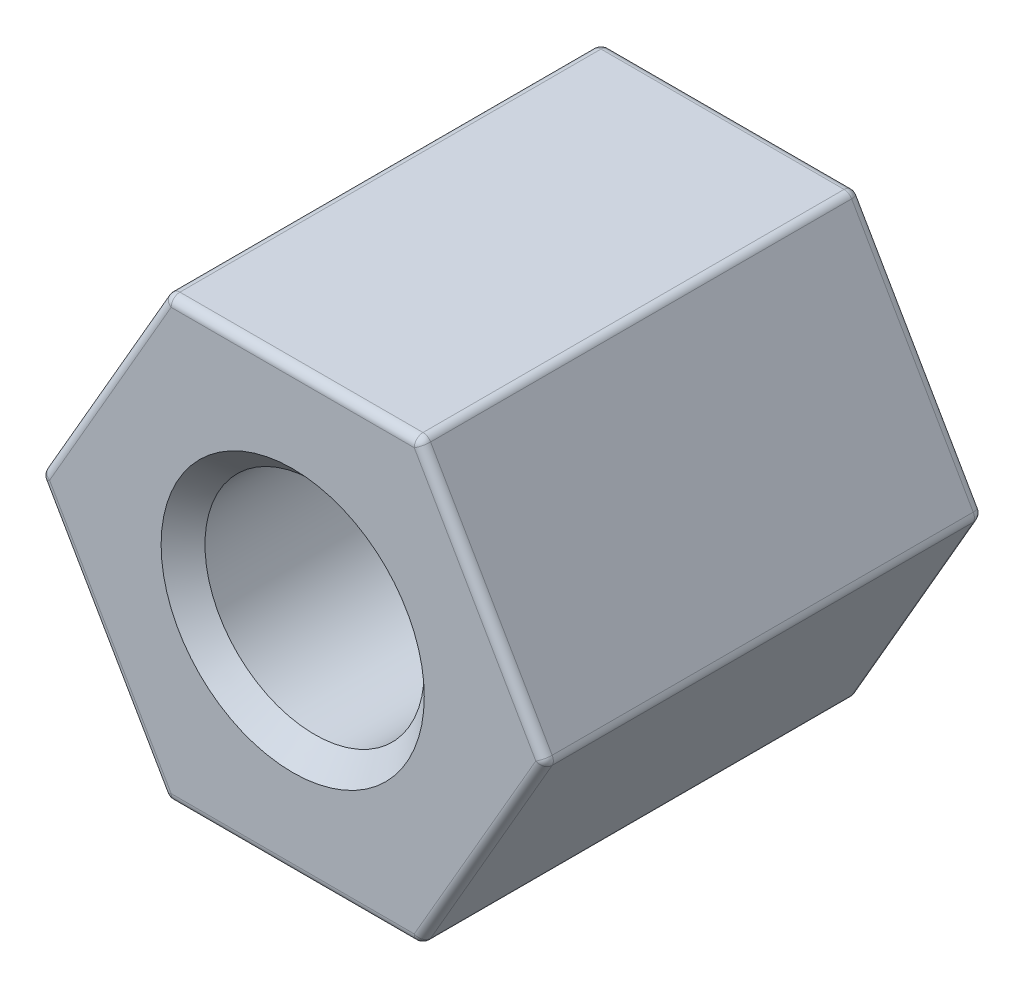
ISO-10303-21;
HEADER;
FILE_DESCRIPTION(('STEP AP214'),'2;1');
FILE_NAME('part.step','',(''),(''),'','','');
FILE_SCHEMA(('AUTOMOTIVE_DESIGN { 1 0 10303 214 1 1 1 1 }'));
ENDSEC;
DATA;
#1=APPLICATION_CONTEXT('core data for automotive mechanical design processes');
#2=APPLICATION_PROTOCOL_DEFINITION('international standard','automotive_design',2000,#1);
#3=PRODUCT_CONTEXT('',#1,'mechanical');
#4=PRODUCT('Part','Part','',(#3));
#5=PRODUCT_RELATED_PRODUCT_CATEGORY('part','',(#4));
#6=PRODUCT_DEFINITION_FORMATION('','',#4);
#7=PRODUCT_DEFINITION_CONTEXT('part definition',#1,'design');
#8=PRODUCT_DEFINITION('design','',#6,#7);
#9=PRODUCT_DEFINITION_SHAPE('','',#8);
#10=(LENGTH_UNIT() NAMED_UNIT(*) SI_UNIT(.MILLI.,.METRE.));
#11=(NAMED_UNIT(*) PLANE_ANGLE_UNIT() SI_UNIT($,.RADIAN.));
#12=(NAMED_UNIT(*) SI_UNIT($,.STERADIAN.) SOLID_ANGLE_UNIT());
#13=UNCERTAINTY_MEASURE_WITH_UNIT(LENGTH_MEASURE(1.E-05),#10,'distance_accuracy_value','');
#14=(GEOMETRIC_REPRESENTATION_CONTEXT(3) GLOBAL_UNCERTAINTY_ASSIGNED_CONTEXT((#13)) GLOBAL_UNIT_ASSIGNED_CONTEXT((#10,
#11,#12)) REPRESENTATION_CONTEXT('',''));
#15=CARTESIAN_POINT('',(0.,0.,0.));
#16=DIRECTION('',(0.,0.,1.));
#17=DIRECTION('',(1.,0.,0.));
#18=AXIS2_PLACEMENT_3D('',#15,#16,#17);
#19=CARTESIAN_POINT('',(1.44337567297407,-2.5,5.));
#20=DIRECTION('',(-0.866025403784439,0.5,0.));
#21=DIRECTION('',(-0.5,-0.866025403784439,0.));
#22=AXIS2_PLACEMENT_3D('',#19,#20,#21);
#23=PLANE('',#22);
#24=DIRECTION('',(0.5,0.866025403784439,0.));
#25=VECTOR('',#24,1.);
#26=CARTESIAN_POINT('',(1.44337567297407,-2.5,4.9));
#27=LINE('',#26,#25);
#28=CARTESIAN_POINT('',(2.85788383248865,-0.0499999999999991,4.9));
#29=VERTEX_POINT('',#28);
#30=CARTESIAN_POINT('',(1.47224318643355,-2.45,4.9));
#31=VERTEX_POINT('',#30);
#32=EDGE_CURVE('E256',#29,#31,#27,.F.);
#33=ORIENTED_EDGE('',*,*,#32,.T.);
#34=DIRECTION('',(0.,0.,-1.));
#35=VECTOR('',#34,1.);
#36=CARTESIAN_POINT('',(1.47224318643355,-2.45,5.));
#37=LINE('',#36,#35);
#38=CARTESIAN_POINT('',(1.47224318643355,-2.45,0.1));
#39=VERTEX_POINT('',#38);
#40=EDGE_CURVE('E258',#31,#39,#37,.T.);
#41=ORIENTED_EDGE('',*,*,#40,.T.);
#42=DIRECTION('',(0.5,0.866025403784439,0.));
#43=VECTOR('',#42,1.);
#44=CARTESIAN_POINT('',(1.44337567297407,-2.5,0.1));
#45=LINE('',#44,#43);
#46=CARTESIAN_POINT('',(2.85788383248865,-0.0499999999999991,0.1));
#47=VERTEX_POINT('',#46);
#48=EDGE_CURVE('E254',#39,#47,#45,.T.);
#49=ORIENTED_EDGE('',*,*,#48,.T.);
#50=DIRECTION('',(0.,0.,-1.));
#51=VECTOR('',#50,1.);
#52=CARTESIAN_POINT('',(2.85788383248865,-0.0499999999999984,5.));
#53=LINE('',#52,#51);
#54=EDGE_CURVE('E252',#47,#29,#53,.F.);
#55=ORIENTED_EDGE('',*,*,#54,.T.);
#56=EDGE_LOOP('',(#33,#41,#49,#55));
#57=FACE_BOUND('',#56,.T.);
#58=ADVANCED_FACE('F38',(#57),#23,.F.);
#59=CARTESIAN_POINT('',(2.88675134594813,0.,5.));
#60=DIRECTION('',(-0.866025403784439,-0.5,0.));
#61=DIRECTION('',(0.5,-0.866025403784439,0.));
#62=AXIS2_PLACEMENT_3D('',#59,#60,#61);
#63=PLANE('',#62);
#64=DIRECTION('',(-0.5,0.866025403784439,0.));
#65=VECTOR('',#64,1.);
#66=CARTESIAN_POINT('',(2.88675134594813,0.,4.9));
#67=LINE('',#66,#65);
#68=CARTESIAN_POINT('',(1.47224318643355,2.45,4.9));
#69=VERTEX_POINT('',#68);
#70=CARTESIAN_POINT('',(2.85788383248865,0.0500000000000006,4.9));
#71=VERTEX_POINT('',#70);
#72=EDGE_CURVE('E180',#69,#71,#67,.F.);
#73=ORIENTED_EDGE('',*,*,#72,.T.);
#74=DIRECTION('',(0.,0.,-1.));
#75=VECTOR('',#74,1.);
#76=CARTESIAN_POINT('',(2.85788383248865,0.0500000000000006,5.));
#77=LINE('',#76,#75);
#78=CARTESIAN_POINT('',(2.85788383248865,0.0500000000000006,0.1));
#79=VERTEX_POINT('',#78);
#80=EDGE_CURVE('E266',#71,#79,#77,.T.);
#81=ORIENTED_EDGE('',*,*,#80,.T.);
#82=DIRECTION('',(-0.5,0.866025403784439,0.));
#83=VECTOR('',#82,1.);
#84=CARTESIAN_POINT('',(2.88675134594813,0.,0.1));
#85=LINE('',#84,#83);
#86=CARTESIAN_POINT('',(1.47224318643355,2.45,0.1));
#87=VERTEX_POINT('',#86);
#88=EDGE_CURVE('E263',#79,#87,#85,.T.);
#89=ORIENTED_EDGE('',*,*,#88,.T.);
#90=DIRECTION('',(0.,0.,-1.));
#91=VECTOR('',#90,1.);
#92=CARTESIAN_POINT('',(1.47224318643355,2.45,5.));
#93=LINE('',#92,#91);
#94=EDGE_CURVE('E261',#87,#69,#93,.F.);
#95=ORIENTED_EDGE('',*,*,#94,.T.);
#96=EDGE_LOOP('',(#73,#81,#89,#95));
#97=FACE_BOUND('',#96,.T.);
#98=ADVANCED_FACE('F396',(#97),#63,.F.);
#99=CARTESIAN_POINT('',(1.44337567297406,2.5,5.));
#100=DIRECTION('',(0.,-1.,0.));
#101=DIRECTION('',(0.,0.,-1.));
#102=AXIS2_PLACEMENT_3D('',#99,#100,#101);
#103=PLANE('',#102);
#104=DIRECTION('',(-1.,0.,0.));
#105=VECTOR('',#104,1.);
#106=CARTESIAN_POINT('',(1.44337567297406,2.5,4.9));
#107=LINE('',#106,#105);
#108=CARTESIAN_POINT('',(-1.3856406460551,2.5,4.9));
#109=VERTEX_POINT('',#108);
#110=CARTESIAN_POINT('',(1.3856406460551,2.5,4.9));
#111=VERTEX_POINT('',#110);
#112=EDGE_CURVE('E47',#109,#111,#107,.F.);
#113=ORIENTED_EDGE('',*,*,#112,.T.);
#114=DIRECTION('',(0.,0.,-1.));
#115=VECTOR('',#114,1.);
#116=CARTESIAN_POINT('',(1.3856406460551,2.5,5.));
#117=LINE('',#116,#115);
#118=CARTESIAN_POINT('',(1.3856406460551,2.5,0.1));
#119=VERTEX_POINT('',#118);
#120=EDGE_CURVE('E11',#111,#119,#117,.T.);
#121=ORIENTED_EDGE('',*,*,#120,.T.);
#122=DIRECTION('',(-1.,0.,0.));
#123=VECTOR('',#122,1.);
#124=CARTESIAN_POINT('',(1.44337567297406,2.5,0.1));
#125=LINE('',#124,#123);
#126=CARTESIAN_POINT('',(-1.3856406460551,2.5,0.1));
#127=VERTEX_POINT('',#126);
#128=EDGE_CURVE('E269',#119,#127,#125,.T.);
#129=ORIENTED_EDGE('',*,*,#128,.T.);
#130=DIRECTION('',(0.,0.,-1.));
#131=VECTOR('',#130,1.);
#132=CARTESIAN_POINT('',(-1.3856406460551,2.5,5.));
#133=LINE('',#132,#131);
#134=EDGE_CURVE('E58',#127,#109,#133,.F.);
#135=ORIENTED_EDGE('',*,*,#134,.T.);
#136=EDGE_LOOP('',(#113,#121,#129,#135));
#137=FACE_BOUND('',#136,.T.);
#138=ADVANCED_FACE('F402',(#137),#103,.F.);
#139=CARTESIAN_POINT('',(-1.44337567297406,2.5,5.));
#140=DIRECTION('',(0.866025403784439,-0.5,0.));
#141=DIRECTION('',(0.5,0.866025403784439,0.));
#142=AXIS2_PLACEMENT_3D('',#139,#140,#141);
#143=PLANE('',#142);
#144=DIRECTION('',(-0.5,-0.866025403784439,0.));
#145=VECTOR('',#144,1.);
#146=CARTESIAN_POINT('',(-1.44337567297406,2.5,0.1));
#147=LINE('',#146,#145);
#148=CARTESIAN_POINT('',(-1.47224318643355,2.45,0.1));
#149=VERTEX_POINT('',#148);
#150=CARTESIAN_POINT('',(-2.85788383248865,0.05,0.1));
#151=VERTEX_POINT('',#150);
#152=EDGE_CURVE('E214',#149,#151,#147,.T.);
#153=ORIENTED_EDGE('',*,*,#152,.T.);
#154=DIRECTION('',(0.,0.,-1.));
#155=VECTOR('',#154,1.);
#156=CARTESIAN_POINT('',(-2.85788383248865,0.0500000000000001,5.));
#157=LINE('',#156,#155);
#158=CARTESIAN_POINT('',(-2.85788383248865,0.05,4.9));
#159=VERTEX_POINT('',#158);
#160=EDGE_CURVE('E219',#151,#159,#157,.F.);
#161=ORIENTED_EDGE('',*,*,#160,.T.);
#162=DIRECTION('',(-0.5,-0.866025403784439,0.));
#163=VECTOR('',#162,1.);
#164=CARTESIAN_POINT('',(-1.44337567297406,2.5,4.9));
#165=LINE('',#164,#163);
#166=CARTESIAN_POINT('',(-1.47224318643355,2.45,4.9));
#167=VERTEX_POINT('',#166);
#168=EDGE_CURVE('E216',#159,#167,#165,.F.);
#169=ORIENTED_EDGE('',*,*,#168,.T.);
#170=DIRECTION('',(0.,0.,-1.));
#171=VECTOR('',#170,1.);
#172=CARTESIAN_POINT('',(-1.47224318643355,2.45,5.));
#173=LINE('',#172,#171);
#174=EDGE_CURVE('E212',#167,#149,#173,.T.);
#175=ORIENTED_EDGE('',*,*,#174,.T.);
#176=EDGE_LOOP('',(#153,#161,#169,#175));
#177=FACE_BOUND('',#176,.T.);
#178=ADVANCED_FACE('F547',(#177),#143,.F.);
#179=CARTESIAN_POINT('',(-2.88675134594813,0.,5.));
#180=DIRECTION('',(0.866025403784439,0.5,0.));
#181=DIRECTION('',(-0.5,0.866025403784439,0.));
#182=AXIS2_PLACEMENT_3D('',#179,#180,#181);
#183=PLANE('',#182);
#184=DIRECTION('',(0.5,-0.866025403784439,0.));
#185=VECTOR('',#184,1.);
#186=CARTESIAN_POINT('',(-2.88675134594813,0.,4.9));
#187=LINE('',#186,#185);
#188=CARTESIAN_POINT('',(-1.47224318643355,-2.45,4.9));
#189=VERTEX_POINT('',#188);
#190=CARTESIAN_POINT('',(-2.85788383248865,-0.0500000000000004,4.9));
#191=VERTEX_POINT('',#190);
#192=EDGE_CURVE('E238',#189,#191,#187,.F.);
#193=ORIENTED_EDGE('',*,*,#192,.T.);
#194=DIRECTION('',(0.,0.,-1.));
#195=VECTOR('',#194,1.);
#196=CARTESIAN_POINT('',(-2.85788383248865,-0.0500000000000004,5.));
#197=LINE('',#196,#195);
#198=CARTESIAN_POINT('',(-2.85788383248865,-0.0500000000000004,0.1));
#199=VERTEX_POINT('',#198);
#200=EDGE_CURVE('E240',#191,#199,#197,.T.);
#201=ORIENTED_EDGE('',*,*,#200,.T.);
#202=DIRECTION('',(0.5,-0.866025403784439,0.));
#203=VECTOR('',#202,1.);
#204=CARTESIAN_POINT('',(-2.88675134594813,0.,0.1));
#205=LINE('',#204,#203);
#206=CARTESIAN_POINT('',(-1.47224318643355,-2.45,0.1));
#207=VERTEX_POINT('',#206);
#208=EDGE_CURVE('E236',#199,#207,#205,.T.);
#209=ORIENTED_EDGE('',*,*,#208,.T.);
#210=DIRECTION('',(0.,0.,-1.));
#211=VECTOR('',#210,1.);
#212=CARTESIAN_POINT('',(-1.47224318643355,-2.45,5.));
#213=LINE('',#212,#211);
#214=EDGE_CURVE('E234',#207,#189,#213,.F.);
#215=ORIENTED_EDGE('',*,*,#214,.T.);
#216=EDGE_LOOP('',(#193,#201,#209,#215));
#217=FACE_BOUND('',#216,.T.);
#218=ADVANCED_FACE('F551',(#217),#183,.F.);
#219=CARTESIAN_POINT('',(-1.44337567297406,-2.5,5.));
#220=DIRECTION('',(0.,1.,0.));
#221=DIRECTION('',(0.,0.,1.));
#222=AXIS2_PLACEMENT_3D('',#219,#220,#221);
#223=PLANE('',#222);
#224=DIRECTION('',(1.,0.,0.));
#225=VECTOR('',#224,1.);
#226=CARTESIAN_POINT('',(-1.44337567297406,-2.5,4.9));
#227=LINE('',#226,#225);
#228=CARTESIAN_POINT('',(1.3856406460551,-2.5,4.9));
#229=VERTEX_POINT('',#228);
#230=CARTESIAN_POINT('',(-1.3856406460551,-2.5,4.9));
#231=VERTEX_POINT('',#230);
#232=EDGE_CURVE('E247',#229,#231,#227,.F.);
#233=ORIENTED_EDGE('',*,*,#232,.T.);
#234=DIRECTION('',(0.,0.,-1.));
#235=VECTOR('',#234,1.);
#236=CARTESIAN_POINT('',(-1.3856406460551,-2.5,5.));
#237=LINE('',#236,#235);
#238=CARTESIAN_POINT('',(-1.3856406460551,-2.5,0.1));
#239=VERTEX_POINT('',#238);
#240=EDGE_CURVE('E249',#231,#239,#237,.T.);
#241=ORIENTED_EDGE('',*,*,#240,.T.);
#242=DIRECTION('',(1.,0.,0.));
#243=VECTOR('',#242,1.);
#244=CARTESIAN_POINT('',(-1.44337567297406,-2.5,0.1));
#245=LINE('',#244,#243);
#246=CARTESIAN_POINT('',(1.3856406460551,-2.5,0.1));
#247=VERTEX_POINT('',#246);
#248=EDGE_CURVE('E245',#239,#247,#245,.T.);
#249=ORIENTED_EDGE('',*,*,#248,.T.);
#250=DIRECTION('',(0.,0.,-1.));
#251=VECTOR('',#250,1.);
#252=CARTESIAN_POINT('',(1.3856406460551,-2.5,5.));
#253=LINE('',#252,#251);
#254=EDGE_CURVE('E243',#247,#229,#253,.F.);
#255=ORIENTED_EDGE('',*,*,#254,.T.);
#256=EDGE_LOOP('',(#233,#241,#249,#255));
#257=FACE_BOUND('',#256,.T.);
#258=ADVANCED_FACE('F557',(#257),#223,.F.);
#259=CARTESIAN_POINT('',(2.88675134594813,0.,5.));
#260=DIRECTION('',(0.,0.,1.));
#261=DIRECTION('',(1.,0.,0.));
#262=AXIS2_PLACEMENT_3D('',#259,#260,#261);
#263=PLANE('',#262);
#264=DIRECTION('',(-1.,0.,0.));
#265=VECTOR('',#264,1.);
#266=CARTESIAN_POINT('',(-1.44337567297406,2.4,5.));
#267=LINE('',#266,#265);
#268=CARTESIAN_POINT('',(1.3856406460551,2.4,5.));
#269=VERTEX_POINT('',#268);
#270=CARTESIAN_POINT('',(-1.3856406460551,2.4,5.));
#271=VERTEX_POINT('',#270);
#272=EDGE_CURVE('E167',#269,#271,#267,.T.);
#273=ORIENTED_EDGE('',*,*,#272,.T.);
#274=DIRECTION('',(-0.5,-0.866025403784439,0.));
#275=VECTOR('',#274,1.);
#276=CARTESIAN_POINT('',(-2.80014880556968,-0.0500000000000006,5.));
#277=LINE('',#276,#275);
#278=CARTESIAN_POINT('',(-2.7712812921102,0.,5.));
#279=VERTEX_POINT('',#278);
#280=EDGE_CURVE('E210',#271,#279,#277,.T.);
#281=ORIENTED_EDGE('',*,*,#280,.T.);
#282=DIRECTION('',(0.5,-0.866025403784439,0.));
#283=VECTOR('',#282,1.);
#284=CARTESIAN_POINT('',(-1.35677313259562,-2.45,5.));
#285=LINE('',#284,#283);
#286=CARTESIAN_POINT('',(-1.3856406460551,-2.4,5.));
#287=VERTEX_POINT('',#286);
#288=EDGE_CURVE('E208',#279,#287,#285,.T.);
#289=ORIENTED_EDGE('',*,*,#288,.T.);
#290=DIRECTION('',(1.,0.,0.));
#291=VECTOR('',#290,1.);
#292=CARTESIAN_POINT('',(1.44337567297407,-2.4,5.));
#293=LINE('',#292,#291);
#294=CARTESIAN_POINT('',(1.3856406460551,-2.4,5.));
#295=VERTEX_POINT('',#294);
#296=EDGE_CURVE('E206',#287,#295,#293,.T.);
#297=ORIENTED_EDGE('',*,*,#296,.T.);
#298=DIRECTION('',(0.5,0.866025403784439,0.));
#299=VECTOR('',#298,1.);
#300=CARTESIAN_POINT('',(2.80014880556968,0.0500000000000007,5.));
#301=LINE('',#300,#299);
#302=CARTESIAN_POINT('',(2.7712812921102,0.,5.));
#303=VERTEX_POINT('',#302);
#304=EDGE_CURVE('E170',#295,#303,#301,.T.);
#305=ORIENTED_EDGE('',*,*,#304,.T.);
#306=DIRECTION('',(-0.5,0.866025403784439,0.));
#307=VECTOR('',#306,1.);
#308=CARTESIAN_POINT('',(1.35677313259562,2.45,5.));
#309=LINE('',#308,#307);
#310=EDGE_CURVE('E161',#303,#269,#309,.T.);
#311=ORIENTED_EDGE('',*,*,#310,.T.);
#312=EDGE_LOOP('',(#273,#281,#289,#297,#305,#311));
#313=FACE_BOUND('',#312,.T.);
#314=CARTESIAN_POINT('',(0.,0.,5.));
#315=DIRECTION('',(0.,0.,1.));
#316=DIRECTION('',(1.,0.,0.));
#317=AXIS2_PLACEMENT_3D('',#314,#315,#316);
#318=CIRCLE('',#317,1.5);
#319=CARTESIAN_POINT('',(1.5,0.,5.));
#320=VERTEX_POINT('',#319);
#321=EDGE_CURVE('E198',#320,#320,#318,.F.);
#322=ORIENTED_EDGE('',*,*,#321,.T.);
#323=EDGE_LOOP('',(#322));
#324=FACE_BOUND('',#323,.T.);
#325=ADVANCED_FACE('F163',(#313,#324),#263,.T.);
#326=CARTESIAN_POINT('',(2.88675134594813,0.,0.));
#327=DIRECTION('',(0.,0.,1.));
#328=DIRECTION('',(1.,0.,0.));
#329=AXIS2_PLACEMENT_3D('',#326,#327,#328);
#330=PLANE('',#329);
#331=DIRECTION('',(0.5,-0.866025403784439,0.));
#332=VECTOR('',#331,1.);
#333=CARTESIAN_POINT('',(-1.35677313259562,-2.45,0.));
#334=LINE('',#333,#332);
#335=CARTESIAN_POINT('',(-1.3856406460551,-2.4,0.));
#336=VERTEX_POINT('',#335);
#337=CARTESIAN_POINT('',(-2.7712812921102,0.,0.));
#338=VERTEX_POINT('',#337);
#339=EDGE_CURVE('E229',#336,#338,#334,.F.);
#340=ORIENTED_EDGE('',*,*,#339,.T.);
#341=DIRECTION('',(-0.5,-0.866025403784439,0.));
#342=VECTOR('',#341,1.);
#343=CARTESIAN_POINT('',(-1.35677313259562,2.45,0.));
#344=LINE('',#343,#342);
#345=CARTESIAN_POINT('',(-1.3856406460551,2.4,0.));
#346=VERTEX_POINT('',#345);
#347=EDGE_CURVE('E231',#338,#346,#344,.F.);
#348=ORIENTED_EDGE('',*,*,#347,.T.);
#349=DIRECTION('',(-1.,0.,0.));
#350=VECTOR('',#349,1.);
#351=CARTESIAN_POINT('',(2.88675134594813,2.4,0.));
#352=LINE('',#351,#350);
#353=CARTESIAN_POINT('',(1.3856406460551,2.4,0.));
#354=VERTEX_POINT('',#353);
#355=EDGE_CURVE('E221',#346,#354,#352,.F.);
#356=ORIENTED_EDGE('',*,*,#355,.T.);
#357=DIRECTION('',(-0.5,0.866025403784439,0.));
#358=VECTOR('',#357,1.);
#359=CARTESIAN_POINT('',(2.80014880556968,-0.0499999999999994,0.));
#360=LINE('',#359,#358);
#361=CARTESIAN_POINT('',(2.7712812921102,0.,0.));
#362=VERTEX_POINT('',#361);
#363=EDGE_CURVE('E223',#354,#362,#360,.F.);
#364=ORIENTED_EDGE('',*,*,#363,.T.);
#365=DIRECTION('',(0.5,0.866025403784439,0.));
#366=VECTOR('',#365,1.);
#367=CARTESIAN_POINT('',(2.80014880556968,0.0500000000000005,0.));
#368=LINE('',#367,#366);
#369=CARTESIAN_POINT('',(1.3856406460551,-2.4,0.));
#370=VERTEX_POINT('',#369);
#371=EDGE_CURVE('E225',#362,#370,#368,.F.);
#372=ORIENTED_EDGE('',*,*,#371,.T.);
#373=DIRECTION('',(1.,0.,0.));
#374=VECTOR('',#373,1.);
#375=CARTESIAN_POINT('',(2.88675134594813,-2.4,0.));
#376=LINE('',#375,#374);
#377=EDGE_CURVE('E227',#370,#336,#376,.F.);
#378=ORIENTED_EDGE('',*,*,#377,.T.);
#379=EDGE_LOOP('',(#340,#348,#356,#364,#372,#378));
#380=FACE_BOUND('',#379,.T.);
#381=CARTESIAN_POINT('',(0.,0.,0.));
#382=DIRECTION('',(0.,0.,1.));
#383=DIRECTION('',(1.,0.,0.));
#384=AXIS2_PLACEMENT_3D('',#381,#382,#383);
#385=CIRCLE('',#384,1.5);
#386=CARTESIAN_POINT('',(1.5,0.,0.));
#387=VERTEX_POINT('',#386);
#388=EDGE_CURVE('E201',#387,#387,#385,.T.);
#389=ORIENTED_EDGE('',*,*,#388,.T.);
#390=EDGE_LOOP('',(#389));
#391=FACE_BOUND('',#390,.T.);
#392=ADVANCED_FACE('F377',(#380,#391),#330,.F.);
#393=CARTESIAN_POINT('',(0.,0.,2.5));
#394=DIRECTION('',(0.,0.,1.));
#395=DIRECTION('',(1.,0.,0.));
#396=AXIS2_PLACEMENT_3D('',#393,#394,#395);
#397=CYLINDRICAL_SURFACE('',#396,1.25);
#398=CARTESIAN_POINT('',(0.,0.,0.250000000000002));
#399=DIRECTION('',(0.,0.,1.));
#400=DIRECTION('',(1.,0.,0.));
#401=AXIS2_PLACEMENT_3D('',#398,#399,#400);
#402=CIRCLE('',#401,1.25);
#403=CARTESIAN_POINT('',(1.25,0.,0.250000000000002));
#404=VERTEX_POINT('',#403);
#405=EDGE_CURVE('E368',#404,#404,#402,.F.);
#406=ORIENTED_EDGE('',*,*,#405,.T.);
#407=EDGE_LOOP('',(#406));
#408=FACE_BOUND('',#407,.T.);
#409=CARTESIAN_POINT('',(0.,0.,4.75));
#410=DIRECTION('',(0.,0.,1.));
#411=DIRECTION('',(1.,0.,0.));
#412=AXIS2_PLACEMENT_3D('',#409,#410,#411);
#413=CIRCLE('',#412,1.25);
#414=CARTESIAN_POINT('',(1.25,0.,4.75));
#415=VERTEX_POINT('',#414);
#416=EDGE_CURVE('E362',#415,#415,#413,.T.);
#417=ORIENTED_EDGE('',*,*,#416,.T.);
#418=EDGE_LOOP('',(#417));
#419=FACE_BOUND('',#418,.T.);
#420=ADVANCED_FACE('F383',(#408,#419),#397,.F.);
#421=CARTESIAN_POINT('',(0.,0.,0.250000000000002));
#422=DIRECTION('',(0.,0.,-1.));
#423=DIRECTION('',(-1.,0.,0.));
#424=AXIS2_PLACEMENT_3D('',#421,#422,#423);
#425=CONICAL_SURFACE('',#424,1.25,0.785398163397446);
#426=ORIENTED_EDGE('',*,*,#388,.F.);
#427=EDGE_LOOP('',(#426));
#428=FACE_BOUND('',#427,.T.);
#429=ORIENTED_EDGE('',*,*,#405,.F.);
#430=EDGE_LOOP('',(#429));
#431=FACE_BOUND('',#430,.T.);
#432=ADVANCED_FACE('F379',(#428,#431),#425,.F.);
#433=CARTESIAN_POINT('',(0.,0.,4.75));
#434=DIRECTION('',(0.,0.,1.));
#435=DIRECTION('',(1.,0.,0.));
#436=AXIS2_PLACEMENT_3D('',#433,#434,#435);
#437=CONICAL_SURFACE('',#436,1.25,0.785398163397449);
#438=ORIENTED_EDGE('',*,*,#321,.F.);
#439=EDGE_LOOP('',(#438));
#440=FACE_BOUND('',#439,.T.);
#441=ORIENTED_EDGE('',*,*,#416,.F.);
#442=EDGE_LOOP('',(#441));
#443=FACE_BOUND('',#442,.T.);
#444=ADVANCED_FACE('F382',(#440,#443),#437,.F.);
#445=CARTESIAN_POINT('',(1.35677313259562,-2.45,0.1));
#446=DIRECTION('',(0.5,0.866025403784439,0.));
#447=DIRECTION('',(-0.866025403784439,0.5,0.));
#448=AXIS2_PLACEMENT_3D('',#445,#446,#447);
#449=CYLINDRICAL_SURFACE('',#448,0.1);
#450=CARTESIAN_POINT('',(2.7712812921102,0.,0.1));
#451=DIRECTION('',(0.5,0.866025403784438,0.));
#452=DIRECTION('',(-0.866025403784438,0.500000000000001,0.));
#453=AXIS2_PLACEMENT_3D('',#450,#451,#452);
#454=CIRCLE('',#453,0.1);
#455=EDGE_CURVE('E42',#47,#362,#454,.T.);
#456=ORIENTED_EDGE('',*,*,#455,.F.);
#457=ORIENTED_EDGE('',*,*,#48,.F.);
#458=CARTESIAN_POINT('',(1.3856406460551,-2.4,0.1));
#459=DIRECTION('',(-0.5,-0.866025403784439,0.));
#460=DIRECTION('',(0.866025403784439,-0.5,0.));
#461=AXIS2_PLACEMENT_3D('',#458,#459,#460);
#462=CIRCLE('',#461,0.1);
#463=EDGE_CURVE('E354',#370,#39,#462,.T.);
#464=ORIENTED_EDGE('',*,*,#463,.F.);
#465=ORIENTED_EDGE('',*,*,#371,.F.);
#466=EDGE_LOOP('',(#456,#457,#464,#465));
#467=FACE_BOUND('',#466,.T.);
#468=ADVANCED_FACE('F40',(#467),#449,.T.);
#469=CARTESIAN_POINT('',(2.7712812921102,0.,0.1));
#470=DIRECTION('',(0.,0.,1.));
#471=DIRECTION('',(1.,0.,0.));
#472=AXIS2_PLACEMENT_3D('',#469,#470,#471);
#473=SPHERICAL_SURFACE('',#472,0.1);
#474=CARTESIAN_POINT('',(2.7712812921102,0.,0.1));
#475=DIRECTION('',(0.,0.,-1.));
#476=DIRECTION('',(-1.,0.,0.));
#477=AXIS2_PLACEMENT_3D('',#474,#475,#476);
#478=CIRCLE('',#477,0.1);
#479=EDGE_CURVE('E349',#47,#79,#478,.F.);
#480=ORIENTED_EDGE('',*,*,#479,.F.);
#481=ORIENTED_EDGE('',*,*,#455,.T.);
#482=CARTESIAN_POINT('',(2.7712812921102,0.,0.1));
#483=DIRECTION('',(0.499999999999995,-0.866025403784441,0.));
#484=DIRECTION('',(0.866025403784441,0.499999999999995,0.));
#485=AXIS2_PLACEMENT_3D('',#482,#483,#484);
#486=CIRCLE('',#485,0.1);
#487=EDGE_CURVE('E352',#79,#362,#486,.F.);
#488=ORIENTED_EDGE('',*,*,#487,.F.);
#489=EDGE_LOOP('',(#480,#481,#488));
#490=FACE_BOUND('',#489,.T.);
#491=ADVANCED_FACE('F514',(#490),#473,.T.);
#492=CARTESIAN_POINT('',(1.3856406460551,-2.4,0.1));
#493=DIRECTION('',(0.,0.,1.));
#494=DIRECTION('',(1.,0.,0.));
#495=AXIS2_PLACEMENT_3D('',#492,#493,#494);
#496=SPHERICAL_SURFACE('',#495,0.1);
#497=CARTESIAN_POINT('',(1.3856406460551,-2.4,0.1));
#498=DIRECTION('',(1.,0.,0.));
#499=DIRECTION('',(0.,0.,-1.));
#500=AXIS2_PLACEMENT_3D('',#497,#498,#499);
#501=CIRCLE('',#500,0.1);
#502=EDGE_CURVE('E344',#370,#247,#501,.F.);
#503=ORIENTED_EDGE('',*,*,#502,.F.);
#504=ORIENTED_EDGE('',*,*,#463,.T.);
#505=CARTESIAN_POINT('',(1.3856406460551,-2.4,0.1));
#506=DIRECTION('',(0.,0.,-1.));
#507=DIRECTION('',(-1.,0.,0.));
#508=AXIS2_PLACEMENT_3D('',#505,#506,#507);
#509=CIRCLE('',#508,0.1);
#510=EDGE_CURVE('E347',#247,#39,#509,.F.);
#511=ORIENTED_EDGE('',*,*,#510,.F.);
#512=EDGE_LOOP('',(#503,#504,#511));
#513=FACE_BOUND('',#512,.T.);
#514=ADVANCED_FACE('F511',(#513),#496,.T.);
#515=CARTESIAN_POINT('',(2.80014880556968,-0.0499999999999994,0.1));
#516=DIRECTION('',(-0.5,0.866025403784439,0.));
#517=DIRECTION('',(-0.866025403784439,-0.5,0.));
#518=AXIS2_PLACEMENT_3D('',#515,#516,#517);
#519=CYLINDRICAL_SURFACE('',#518,0.1);
#520=ORIENTED_EDGE('',*,*,#487,.T.);
#521=ORIENTED_EDGE('',*,*,#363,.F.);
#522=CARTESIAN_POINT('',(1.3856406460551,2.4,0.1));
#523=DIRECTION('',(-0.500000000000001,0.866025403784438,0.));
#524=DIRECTION('',(-0.866025403784438,-0.500000000000001,0.));
#525=AXIS2_PLACEMENT_3D('',#522,#523,#524);
#526=CIRCLE('',#525,0.1);
#527=EDGE_CURVE('E341',#87,#354,#526,.T.);
#528=ORIENTED_EDGE('',*,*,#527,.F.);
#529=ORIENTED_EDGE('',*,*,#88,.F.);
#530=EDGE_LOOP('',(#520,#521,#528,#529));
#531=FACE_BOUND('',#530,.T.);
#532=ADVANCED_FACE('F507',(#531),#519,.T.);
#533=CARTESIAN_POINT('',(2.7712812921102,0.,5.));
#534=DIRECTION('',(0.,0.,-1.));
#535=DIRECTION('',(-1.,0.,0.));
#536=AXIS2_PLACEMENT_3D('',#533,#534,#535);
#537=CYLINDRICAL_SURFACE('',#536,0.1);
#538=ORIENTED_EDGE('',*,*,#479,.T.);
#539=ORIENTED_EDGE('',*,*,#80,.F.);
#540=CARTESIAN_POINT('',(2.7712812921102,0.,4.9));
#541=DIRECTION('',(0.,0.,1.));
#542=DIRECTION('',(1.,0.,0.));
#543=AXIS2_PLACEMENT_3D('',#540,#541,#542);
#544=CIRCLE('',#543,0.1);
#545=EDGE_CURVE('E338',#29,#71,#544,.T.);
#546=ORIENTED_EDGE('',*,*,#545,.F.);
#547=ORIENTED_EDGE('',*,*,#54,.F.);
#548=EDGE_LOOP('',(#538,#539,#546,#547));
#549=FACE_BOUND('',#548,.T.);
#550=ADVANCED_FACE('F503',(#549),#537,.T.);
#551=CARTESIAN_POINT('',(2.80014880556968,0.0500000000000005,4.9));
#552=DIRECTION('',(-0.5,-0.866025403784439,0.));
#553=DIRECTION('',(0.866025403784439,-0.5,0.));
#554=AXIS2_PLACEMENT_3D('',#551,#552,#553);
#555=CYLINDRICAL_SURFACE('',#554,0.1);
#556=CARTESIAN_POINT('',(1.3856406460551,-2.4,4.9));
#557=DIRECTION('',(-0.500000000000001,-0.866025403784438,0.));
#558=DIRECTION('',(0.866025403784438,-0.500000000000001,0.));
#559=AXIS2_PLACEMENT_3D('',#556,#557,#558);
#560=CIRCLE('',#559,0.1);
#561=EDGE_CURVE('E332',#31,#295,#560,.T.);
#562=ORIENTED_EDGE('',*,*,#561,.F.);
#563=ORIENTED_EDGE('',*,*,#32,.F.);
#564=CARTESIAN_POINT('',(2.7712812921102,0.,4.9));
#565=DIRECTION('',(0.499999999999997,0.866025403784441,0.));
#566=DIRECTION('',(-0.866025403784441,0.499999999999997,0.));
#567=AXIS2_PLACEMENT_3D('',#564,#565,#566);
#568=CIRCLE('',#567,0.1);
#569=EDGE_CURVE('E335',#303,#29,#568,.T.);
#570=ORIENTED_EDGE('',*,*,#569,.F.);
#571=ORIENTED_EDGE('',*,*,#304,.F.);
#572=EDGE_LOOP('',(#562,#563,#570,#571));
#573=FACE_BOUND('',#572,.T.);
#574=ADVANCED_FACE('F499',(#573),#555,.T.);
#575=CARTESIAN_POINT('',(1.3856406460551,-2.4,5.));
#576=DIRECTION('',(0.,0.,-1.));
#577=DIRECTION('',(-1.,0.,0.));
#578=AXIS2_PLACEMENT_3D('',#575,#576,#577);
#579=CYLINDRICAL_SURFACE('',#578,0.1);
#580=ORIENTED_EDGE('',*,*,#510,.T.);
#581=ORIENTED_EDGE('',*,*,#40,.F.);
#582=CARTESIAN_POINT('',(1.3856406460551,-2.4,4.9));
#583=DIRECTION('',(0.,0.,1.));
#584=DIRECTION('',(1.,0.,0.));
#585=AXIS2_PLACEMENT_3D('',#582,#583,#584);
#586=CIRCLE('',#585,0.1);
#587=EDGE_CURVE('E329',#229,#31,#586,.T.);
#588=ORIENTED_EDGE('',*,*,#587,.F.);
#589=ORIENTED_EDGE('',*,*,#254,.F.);
#590=EDGE_LOOP('',(#580,#581,#588,#589));
#591=FACE_BOUND('',#590,.T.);
#592=ADVANCED_FACE('F495',(#591),#579,.T.);
#593=CARTESIAN_POINT('',(-1.44337567297406,-2.4,0.1));
#594=DIRECTION('',(1.,0.,0.));
#595=DIRECTION('',(0.,0.,-1.));
#596=AXIS2_PLACEMENT_3D('',#593,#594,#595);
#597=CYLINDRICAL_SURFACE('',#596,0.1);
#598=ORIENTED_EDGE('',*,*,#502,.T.);
#599=ORIENTED_EDGE('',*,*,#248,.F.);
#600=CARTESIAN_POINT('',(-1.3856406460551,-2.4,0.1));
#601=DIRECTION('',(-1.,0.,0.));
#602=DIRECTION('',(0.,0.,1.));
#603=AXIS2_PLACEMENT_3D('',#600,#601,#602);
#604=CIRCLE('',#603,0.1);
#605=EDGE_CURVE('E326',#336,#239,#604,.T.);
#606=ORIENTED_EDGE('',*,*,#605,.F.);
#607=ORIENTED_EDGE('',*,*,#377,.F.);
#608=EDGE_LOOP('',(#598,#599,#606,#607));
#609=FACE_BOUND('',#608,.T.);
#610=ADVANCED_FACE('F491',(#609),#597,.T.);
#611=CARTESIAN_POINT('',(1.3856406460551,2.4,0.1));
#612=DIRECTION('',(0.,0.,1.));
#613=DIRECTION('',(1.,0.,0.));
#614=AXIS2_PLACEMENT_3D('',#611,#612,#613);
#615=SPHERICAL_SURFACE('',#614,0.1);
#616=CARTESIAN_POINT('',(1.3856406460551,2.4,0.1));
#617=DIRECTION('',(0.,0.,-1.));
#618=DIRECTION('',(-1.,0.,0.));
#619=AXIS2_PLACEMENT_3D('',#616,#617,#618);
#620=CIRCLE('',#619,0.1);
#621=EDGE_CURVE('E320',#87,#119,#620,.F.);
#622=ORIENTED_EDGE('',*,*,#621,.F.);
#623=ORIENTED_EDGE('',*,*,#527,.T.);
#624=CARTESIAN_POINT('',(1.3856406460551,2.4,0.1));
#625=DIRECTION('',(1.,0.,0.));
#626=DIRECTION('',(0.,1.,0.));
#627=AXIS2_PLACEMENT_3D('',#624,#625,#626);
#628=CIRCLE('',#627,0.1);
#629=EDGE_CURVE('E323',#119,#354,#628,.F.);
#630=ORIENTED_EDGE('',*,*,#629,.F.);
#631=EDGE_LOOP('',(#622,#623,#630));
#632=FACE_BOUND('',#631,.T.);
#633=ADVANCED_FACE('F487',(#632),#615,.T.);
#634=CARTESIAN_POINT('',(2.7712812921102,0.,4.9));
#635=DIRECTION('',(0.,0.,1.));
#636=DIRECTION('',(1.,0.,0.));
#637=AXIS2_PLACEMENT_3D('',#634,#635,#636);
#638=SPHERICAL_SURFACE('',#637,0.1);
#639=ORIENTED_EDGE('',*,*,#569,.T.);
#640=ORIENTED_EDGE('',*,*,#545,.T.);
#641=CARTESIAN_POINT('',(2.7712812921102,0.,4.9));
#642=DIRECTION('',(0.500000000000001,-0.866025403784438,0.));
#643=DIRECTION('',(0.866025403784438,0.500000000000001,0.));
#644=AXIS2_PLACEMENT_3D('',#641,#642,#643);
#645=CIRCLE('',#644,0.1);
#646=EDGE_CURVE('E318',#303,#71,#645,.F.);
#647=ORIENTED_EDGE('',*,*,#646,.F.);
#648=EDGE_LOOP('',(#639,#640,#647));
#649=FACE_BOUND('',#648,.T.);
#650=ADVANCED_FACE('F483',(#649),#638,.T.);
#651=CARTESIAN_POINT('',(1.3856406460551,-2.4,4.9));
#652=DIRECTION('',(0.,0.,1.));
#653=DIRECTION('',(1.,0.,0.));
#654=AXIS2_PLACEMENT_3D('',#651,#652,#653);
#655=SPHERICAL_SURFACE('',#654,0.1);
#656=ORIENTED_EDGE('',*,*,#587,.T.);
#657=ORIENTED_EDGE('',*,*,#561,.T.);
#658=CARTESIAN_POINT('',(1.3856406460551,-2.4,4.9));
#659=DIRECTION('',(1.,0.,0.));
#660=DIRECTION('',(0.,0.,-1.));
#661=AXIS2_PLACEMENT_3D('',#658,#659,#660);
#662=CIRCLE('',#661,0.1);
#663=EDGE_CURVE('E315',#229,#295,#662,.F.);
#664=ORIENTED_EDGE('',*,*,#663,.F.);
#665=EDGE_LOOP('',(#656,#657,#664));
#666=FACE_BOUND('',#665,.T.);
#667=ADVANCED_FACE('F479',(#666),#655,.T.);
#668=CARTESIAN_POINT('',(-1.3856406460551,-2.4,0.1));
#669=DIRECTION('',(0.,0.,1.));
#670=DIRECTION('',(1.,0.,0.));
#671=AXIS2_PLACEMENT_3D('',#668,#669,#670);
#672=SPHERICAL_SURFACE('',#671,0.1);
#673=CARTESIAN_POINT('',(-1.3856406460551,-2.4,0.1));
#674=DIRECTION('',(0.500000000000001,-0.866025403784438,0.));
#675=DIRECTION('',(0.866025403784438,0.500000000000001,0.));
#676=AXIS2_PLACEMENT_3D('',#673,#674,#675);
#677=CIRCLE('',#676,0.1);
#678=EDGE_CURVE('E310',#336,#207,#677,.F.);
#679=ORIENTED_EDGE('',*,*,#678,.F.);
#680=ORIENTED_EDGE('',*,*,#605,.T.);
#681=CARTESIAN_POINT('',(-1.3856406460551,-2.4,0.1));
#682=DIRECTION('',(0.,0.,-1.));
#683=DIRECTION('',(-1.,0.,0.));
#684=AXIS2_PLACEMENT_3D('',#681,#682,#683);
#685=CIRCLE('',#684,0.1);
#686=EDGE_CURVE('E313',#207,#239,#685,.F.);
#687=ORIENTED_EDGE('',*,*,#686,.F.);
#688=EDGE_LOOP('',(#679,#680,#687));
#689=FACE_BOUND('',#688,.T.);
#690=ADVANCED_FACE('F475',(#689),#672,.T.);
#691=CARTESIAN_POINT('',(1.44337567297406,2.4,0.1));
#692=DIRECTION('',(-1.,0.,0.));
#693=DIRECTION('',(0.,0.,1.));
#694=AXIS2_PLACEMENT_3D('',#691,#692,#693);
#695=CYLINDRICAL_SURFACE('',#694,0.1);
#696=ORIENTED_EDGE('',*,*,#629,.T.);
#697=ORIENTED_EDGE('',*,*,#355,.F.);
#698=CARTESIAN_POINT('',(-1.3856406460551,2.4,0.1));
#699=DIRECTION('',(-1.,0.,0.));
#700=DIRECTION('',(0.,0.,1.));
#701=AXIS2_PLACEMENT_3D('',#698,#699,#700);
#702=CIRCLE('',#701,0.1);
#703=EDGE_CURVE('E305',#127,#346,#702,.T.);
#704=ORIENTED_EDGE('',*,*,#703,.F.);
#705=ORIENTED_EDGE('',*,*,#128,.F.);
#706=EDGE_LOOP('',(#696,#697,#704,#705));
#707=FACE_BOUND('',#706,.T.);
#708=ADVANCED_FACE('F471',(#707),#695,.T.);
#709=CARTESIAN_POINT('',(1.3856406460551,2.4,5.));
#710=DIRECTION('',(0.,0.,-1.));
#711=DIRECTION('',(-1.,0.,0.));
#712=AXIS2_PLACEMENT_3D('',#709,#710,#711);
#713=CYLINDRICAL_SURFACE('',#712,0.1);
#714=ORIENTED_EDGE('',*,*,#621,.T.);
#715=ORIENTED_EDGE('',*,*,#120,.F.);
#716=CARTESIAN_POINT('',(1.3856406460551,2.4,4.9));
#717=DIRECTION('',(0.,0.,1.));
#718=DIRECTION('',(1.,0.,0.));
#719=AXIS2_PLACEMENT_3D('',#716,#717,#718);
#720=CIRCLE('',#719,0.1);
#721=EDGE_CURVE('E184',#69,#111,#720,.T.);
#722=ORIENTED_EDGE('',*,*,#721,.F.);
#723=ORIENTED_EDGE('',*,*,#94,.F.);
#724=EDGE_LOOP('',(#714,#715,#722,#723));
#725=FACE_BOUND('',#724,.T.);
#726=ADVANCED_FACE('F468',(#725),#713,.T.);
#727=CARTESIAN_POINT('',(2.80014880556968,-0.0499999999999994,4.9));
#728=DIRECTION('',(0.5,-0.866025403784439,0.));
#729=DIRECTION('',(0.866025403784439,0.5,0.));
#730=AXIS2_PLACEMENT_3D('',#727,#728,#729);
#731=CYLINDRICAL_SURFACE('',#730,0.1);
#732=ORIENTED_EDGE('',*,*,#646,.T.);
#733=ORIENTED_EDGE('',*,*,#72,.F.);
#734=CARTESIAN_POINT('',(1.3856406460551,2.4,4.9));
#735=DIRECTION('',(-0.499999999999999,0.866025403784439,0.));
#736=DIRECTION('',(-0.866025403784439,-0.499999999999999,0.));
#737=AXIS2_PLACEMENT_3D('',#734,#735,#736);
#738=CIRCLE('',#737,0.1);
#739=EDGE_CURVE('E177',#269,#69,#738,.T.);
#740=ORIENTED_EDGE('',*,*,#739,.F.);
#741=ORIENTED_EDGE('',*,*,#310,.F.);
#742=EDGE_LOOP('',(#732,#733,#740,#741));
#743=FACE_BOUND('',#742,.T.);
#744=ADVANCED_FACE('F179',(#743),#731,.T.);
#745=CARTESIAN_POINT('',(2.88675134594813,-2.4,4.9));
#746=DIRECTION('',(-1.,0.,0.));
#747=DIRECTION('',(0.,0.,1.));
#748=AXIS2_PLACEMENT_3D('',#745,#746,#747);
#749=CYLINDRICAL_SURFACE('',#748,0.1);
#750=ORIENTED_EDGE('',*,*,#663,.T.);
#751=ORIENTED_EDGE('',*,*,#296,.F.);
#752=CARTESIAN_POINT('',(-1.3856406460551,-2.4,4.9));
#753=DIRECTION('',(-1.,0.,0.));
#754=DIRECTION('',(0.,0.,1.));
#755=AXIS2_PLACEMENT_3D('',#752,#753,#754);
#756=CIRCLE('',#755,0.1);
#757=EDGE_CURVE('E185',#231,#287,#756,.T.);
#758=ORIENTED_EDGE('',*,*,#757,.F.);
#759=ORIENTED_EDGE('',*,*,#232,.F.);
#760=EDGE_LOOP('',(#750,#751,#758,#759));
#761=FACE_BOUND('',#760,.T.);
#762=ADVANCED_FACE('F461',(#761),#749,.T.);
#763=CARTESIAN_POINT('',(-1.3856406460551,-2.4,5.));
#764=DIRECTION('',(0.,0.,-1.));
#765=DIRECTION('',(-1.,0.,0.));
#766=AXIS2_PLACEMENT_3D('',#763,#764,#765);
#767=CYLINDRICAL_SURFACE('',#766,0.1);
#768=ORIENTED_EDGE('',*,*,#686,.T.);
#769=ORIENTED_EDGE('',*,*,#240,.F.);
#770=CARTESIAN_POINT('',(-1.3856406460551,-2.4,4.9));
#771=DIRECTION('',(0.,0.,1.));
#772=DIRECTION('',(1.,0.,0.));
#773=AXIS2_PLACEMENT_3D('',#770,#771,#772);
#774=CIRCLE('',#773,0.1);
#775=EDGE_CURVE('E299',#189,#231,#774,.T.);
#776=ORIENTED_EDGE('',*,*,#775,.F.);
#777=ORIENTED_EDGE('',*,*,#214,.F.);
#778=EDGE_LOOP('',(#768,#769,#776,#777));
#779=FACE_BOUND('',#778,.T.);
#780=ADVANCED_FACE('F457',(#779),#767,.T.);
#781=CARTESIAN_POINT('',(-2.80014880556968,0.0500000000000001,0.1));
#782=DIRECTION('',(0.5,-0.866025403784439,0.));
#783=DIRECTION('',(0.866025403784439,0.5,0.));
#784=AXIS2_PLACEMENT_3D('',#781,#782,#783);
#785=CYLINDRICAL_SURFACE('',#784,0.1);
#786=ORIENTED_EDGE('',*,*,#678,.T.);
#787=ORIENTED_EDGE('',*,*,#208,.F.);
#788=CARTESIAN_POINT('',(-2.7712812921102,0.,0.1));
#789=DIRECTION('',(-0.500000000000002,0.866025403784438,0.));
#790=DIRECTION('',(-0.866025403784438,-0.500000000000002,0.));
#791=AXIS2_PLACEMENT_3D('',#788,#789,#790);
#792=CIRCLE('',#791,0.1);
#793=EDGE_CURVE('E296',#338,#199,#792,.T.);
#794=ORIENTED_EDGE('',*,*,#793,.F.);
#795=ORIENTED_EDGE('',*,*,#339,.F.);
#796=EDGE_LOOP('',(#786,#787,#794,#795));
#797=FACE_BOUND('',#796,.T.);
#798=ADVANCED_FACE('F453',(#797),#785,.T.);
#799=CARTESIAN_POINT('',(-1.35677313259562,2.45,0.1));
#800=DIRECTION('',(-0.5,-0.866025403784439,0.));
#801=DIRECTION('',(0.866025403784439,-0.5,0.));
#802=AXIS2_PLACEMENT_3D('',#799,#800,#801);
#803=CYLINDRICAL_SURFACE('',#802,0.1);
#804=CARTESIAN_POINT('',(-1.3856406460551,2.4,0.1));
#805=DIRECTION('',(0.5,0.866025403784439,0.));
#806=DIRECTION('',(-0.866025403784439,0.5,0.));
#807=AXIS2_PLACEMENT_3D('',#804,#805,#806);
#808=CIRCLE('',#807,0.1);
#809=EDGE_CURVE('E307',#346,#149,#808,.T.);
#810=ORIENTED_EDGE('',*,*,#809,.F.);
#811=ORIENTED_EDGE('',*,*,#347,.F.);
#812=CARTESIAN_POINT('',(-2.7712812921102,0.,0.1));
#813=DIRECTION('',(-0.499999999999999,-0.866025403784439,0.));
#814=DIRECTION('',(0.866025403784439,-0.499999999999999,0.));
#815=AXIS2_PLACEMENT_3D('',#812,#813,#814);
#816=CIRCLE('',#815,0.1);
#817=EDGE_CURVE('E293',#151,#338,#816,.T.);
#818=ORIENTED_EDGE('',*,*,#817,.F.);
#819=ORIENTED_EDGE('',*,*,#152,.F.);
#820=EDGE_LOOP('',(#810,#811,#818,#819));
#821=FACE_BOUND('',#820,.T.);
#822=ADVANCED_FACE('F449',(#821),#803,.T.);
#823=CARTESIAN_POINT('',(-1.3856406460551,2.4,0.1));
#824=DIRECTION('',(0.,0.,1.));
#825=DIRECTION('',(1.,0.,0.));
#826=AXIS2_PLACEMENT_3D('',#823,#824,#825);
#827=SPHERICAL_SURFACE('',#826,0.1);
#828=ORIENTED_EDGE('',*,*,#703,.T.);
#829=ORIENTED_EDGE('',*,*,#809,.T.);
#830=CARTESIAN_POINT('',(-1.3856406460551,2.4,0.1));
#831=DIRECTION('',(0.,0.,-1.));
#832=DIRECTION('',(-1.,0.,0.));
#833=AXIS2_PLACEMENT_3D('',#830,#831,#832);
#834=CIRCLE('',#833,0.1);
#835=EDGE_CURVE('E191',#127,#149,#834,.F.);
#836=ORIENTED_EDGE('',*,*,#835,.F.);
#837=EDGE_LOOP('',(#828,#829,#836));
#838=FACE_BOUND('',#837,.T.);
#839=ADVANCED_FACE('F446',(#838),#827,.T.);
#840=CARTESIAN_POINT('',(1.3856406460551,2.4,4.9));
#841=DIRECTION('',(0.,0.,1.));
#842=DIRECTION('',(1.,0.,0.));
#843=AXIS2_PLACEMENT_3D('',#840,#841,#842);
#844=SPHERICAL_SURFACE('',#843,0.1);
#845=ORIENTED_EDGE('',*,*,#739,.T.);
#846=ORIENTED_EDGE('',*,*,#721,.T.);
#847=CARTESIAN_POINT('',(1.3856406460551,2.4,4.9));
#848=DIRECTION('',(1.,0.,0.));
#849=DIRECTION('',(0.,0.,-1.));
#850=AXIS2_PLACEMENT_3D('',#847,#848,#849);
#851=CIRCLE('',#850,0.1);
#852=EDGE_CURVE('E188',#269,#111,#851,.F.);
#853=ORIENTED_EDGE('',*,*,#852,.F.);
#854=EDGE_LOOP('',(#845,#846,#853));
#855=FACE_BOUND('',#854,.T.);
#856=ADVANCED_FACE('F189',(#855),#844,.T.);
#857=CARTESIAN_POINT('',(-1.3856406460551,-2.4,4.9));
#858=DIRECTION('',(0.,0.,1.));
#859=DIRECTION('',(1.,0.,0.));
#860=AXIS2_PLACEMENT_3D('',#857,#858,#859);
#861=SPHERICAL_SURFACE('',#860,0.1);
#862=ORIENTED_EDGE('',*,*,#775,.T.);
#863=ORIENTED_EDGE('',*,*,#757,.T.);
#864=CARTESIAN_POINT('',(-1.3856406460551,-2.4,4.9));
#865=DIRECTION('',(0.500000000000004,-0.866025403784436,0.));
#866=DIRECTION('',(0.866025403784437,0.500000000000004,0.));
#867=AXIS2_PLACEMENT_3D('',#864,#865,#866);
#868=CIRCLE('',#867,0.1);
#869=EDGE_CURVE('E192',#189,#287,#868,.F.);
#870=ORIENTED_EDGE('',*,*,#869,.F.);
#871=EDGE_LOOP('',(#862,#863,#870));
#872=FACE_BOUND('',#871,.T.);
#873=ADVANCED_FACE('F439',(#872),#861,.T.);
#874=CARTESIAN_POINT('',(-2.7712812921102,0.,0.1));
#875=DIRECTION('',(0.,0.,1.));
#876=DIRECTION('',(1.,0.,0.));
#877=AXIS2_PLACEMENT_3D('',#874,#875,#876);
#878=SPHERICAL_SURFACE('',#877,0.1);
#879=ORIENTED_EDGE('',*,*,#817,.T.);
#880=ORIENTED_EDGE('',*,*,#793,.T.);
#881=CARTESIAN_POINT('',(-2.7712812921102,0.,0.1));
#882=DIRECTION('',(0.,0.,-1.));
#883=DIRECTION('',(-1.,0.,0.));
#884=AXIS2_PLACEMENT_3D('',#881,#882,#883);
#885=CIRCLE('',#884,0.1);
#886=EDGE_CURVE('E287',#151,#199,#885,.F.);
#887=ORIENTED_EDGE('',*,*,#886,.F.);
#888=EDGE_LOOP('',(#879,#880,#887));
#889=FACE_BOUND('',#888,.T.);
#890=ADVANCED_FACE('F435',(#889),#878,.T.);
#891=CARTESIAN_POINT('',(-1.3856406460551,2.4,5.));
#892=DIRECTION('',(0.,0.,-1.));
#893=DIRECTION('',(-1.,0.,0.));
#894=AXIS2_PLACEMENT_3D('',#891,#892,#893);
#895=CYLINDRICAL_SURFACE('',#894,0.1);
#896=ORIENTED_EDGE('',*,*,#835,.T.);
#897=ORIENTED_EDGE('',*,*,#174,.F.);
#898=CARTESIAN_POINT('',(-1.3856406460551,2.4,4.9));
#899=DIRECTION('',(0.,0.,1.));
#900=DIRECTION('',(1.,0.,0.));
#901=AXIS2_PLACEMENT_3D('',#898,#899,#900);
#902=CIRCLE('',#901,0.1);
#903=EDGE_CURVE('E284',#109,#167,#902,.T.);
#904=ORIENTED_EDGE('',*,*,#903,.F.);
#905=ORIENTED_EDGE('',*,*,#134,.F.);
#906=EDGE_LOOP('',(#896,#897,#904,#905));
#907=FACE_BOUND('',#906,.T.);
#908=ADVANCED_FACE('F432',(#907),#895,.T.);
#909=CARTESIAN_POINT('',(2.88675134594813,2.4,4.9));
#910=DIRECTION('',(1.,0.,0.));
#911=DIRECTION('',(0.,0.,-1.));
#912=AXIS2_PLACEMENT_3D('',#909,#910,#911);
#913=CYLINDRICAL_SURFACE('',#912,0.1);
#914=ORIENTED_EDGE('',*,*,#852,.T.);
#915=ORIENTED_EDGE('',*,*,#112,.F.);
#916=CARTESIAN_POINT('',(-1.3856406460551,2.4,4.9));
#917=DIRECTION('',(-1.,0.,0.));
#918=DIRECTION('',(0.,0.,1.));
#919=AXIS2_PLACEMENT_3D('',#916,#917,#918);
#920=CIRCLE('',#919,0.1);
#921=EDGE_CURVE('E196',#271,#109,#920,.T.);
#922=ORIENTED_EDGE('',*,*,#921,.F.);
#923=ORIENTED_EDGE('',*,*,#272,.F.);
#924=EDGE_LOOP('',(#914,#915,#922,#923));
#925=FACE_BOUND('',#924,.T.);
#926=ADVANCED_FACE('F194',(#925),#913,.T.);
#927=CARTESIAN_POINT('',(-1.35677313259562,-2.45,4.9));
#928=DIRECTION('',(-0.5,0.866025403784439,0.));
#929=DIRECTION('',(-0.866025403784439,-0.5,0.));
#930=AXIS2_PLACEMENT_3D('',#927,#928,#929);
#931=CYLINDRICAL_SURFACE('',#930,0.1);
#932=ORIENTED_EDGE('',*,*,#869,.T.);
#933=ORIENTED_EDGE('',*,*,#288,.F.);
#934=CARTESIAN_POINT('',(-2.7712812921102,0.,4.9));
#935=DIRECTION('',(-0.500000000000001,0.866025403784438,0.));
#936=DIRECTION('',(-0.866025403784438,-0.500000000000001,0.));
#937=AXIS2_PLACEMENT_3D('',#934,#935,#936);
#938=CIRCLE('',#937,0.1);
#939=EDGE_CURVE('E280',#191,#279,#938,.T.);
#940=ORIENTED_EDGE('',*,*,#939,.F.);
#941=ORIENTED_EDGE('',*,*,#192,.F.);
#942=EDGE_LOOP('',(#932,#933,#940,#941));
#943=FACE_BOUND('',#942,.T.);
#944=ADVANCED_FACE('F425',(#943),#931,.T.);
#945=CARTESIAN_POINT('',(-2.7712812921102,0.,5.));
#946=DIRECTION('',(0.,0.,-1.));
#947=DIRECTION('',(-1.,0.,0.));
#948=AXIS2_PLACEMENT_3D('',#945,#946,#947);
#949=CYLINDRICAL_SURFACE('',#948,0.1);
#950=ORIENTED_EDGE('',*,*,#886,.T.);
#951=ORIENTED_EDGE('',*,*,#200,.F.);
#952=CARTESIAN_POINT('',(-2.7712812921102,0.,4.9));
#953=DIRECTION('',(0.,0.,1.));
#954=DIRECTION('',(1.,0.,0.));
#955=AXIS2_PLACEMENT_3D('',#952,#953,#954);
#956=CIRCLE('',#955,0.1);
#957=EDGE_CURVE('E277',#159,#191,#956,.T.);
#958=ORIENTED_EDGE('',*,*,#957,.F.);
#959=ORIENTED_EDGE('',*,*,#160,.F.);
#960=EDGE_LOOP('',(#950,#951,#958,#959));
#961=FACE_BOUND('',#960,.T.);
#962=ADVANCED_FACE('F421',(#961),#949,.T.);
#963=CARTESIAN_POINT('',(-1.3856406460551,2.4,4.9));
#964=DIRECTION('',(0.,0.,1.));
#965=DIRECTION('',(1.,0.,0.));
#966=AXIS2_PLACEMENT_3D('',#963,#964,#965);
#967=SPHERICAL_SURFACE('',#966,0.1);
#968=ORIENTED_EDGE('',*,*,#921,.T.);
#969=ORIENTED_EDGE('',*,*,#903,.T.);
#970=CARTESIAN_POINT('',(-1.3856406460551,2.4,4.9));
#971=DIRECTION('',(0.500000000000001,0.866025403784438,0.));
#972=DIRECTION('',(-0.866025403784438,0.500000000000001,0.));
#973=AXIS2_PLACEMENT_3D('',#970,#971,#972);
#974=CIRCLE('',#973,0.1);
#975=EDGE_CURVE('E275',#271,#167,#974,.F.);
#976=ORIENTED_EDGE('',*,*,#975,.F.);
#977=EDGE_LOOP('',(#968,#969,#976));
#978=FACE_BOUND('',#977,.T.);
#979=ADVANCED_FACE('F417',(#978),#967,.T.);
#980=CARTESIAN_POINT('',(-2.7712812921102,0.,4.9));
#981=DIRECTION('',(0.,0.,1.));
#982=DIRECTION('',(1.,0.,0.));
#983=AXIS2_PLACEMENT_3D('',#980,#981,#982);
#984=SPHERICAL_SURFACE('',#983,0.1);
#985=ORIENTED_EDGE('',*,*,#957,.T.);
#986=ORIENTED_EDGE('',*,*,#939,.T.);
#987=CARTESIAN_POINT('',(-2.7712812921102,0.,4.9));
#988=DIRECTION('',(-0.500000000000004,-0.866025403784436,0.));
#989=DIRECTION('',(0.866025403784436,-0.500000000000004,0.));
#990=AXIS2_PLACEMENT_3D('',#987,#988,#989);
#991=CIRCLE('',#990,0.1);
#992=EDGE_CURVE('E273',#159,#279,#991,.F.);
#993=ORIENTED_EDGE('',*,*,#992,.F.);
#994=EDGE_LOOP('',(#985,#986,#993));
#995=FACE_BOUND('',#994,.T.);
#996=ADVANCED_FACE('F413',(#995),#984,.T.);
#997=CARTESIAN_POINT('',(-1.35677313259562,2.45,4.9));
#998=DIRECTION('',(0.5,0.866025403784439,0.));
#999=DIRECTION('',(-0.866025403784439,0.5,0.));
#1000=AXIS2_PLACEMENT_3D('',#997,#998,#999);
#1001=CYLINDRICAL_SURFACE('',#1000,0.1);
#1002=ORIENTED_EDGE('',*,*,#975,.T.);
#1003=ORIENTED_EDGE('',*,*,#168,.F.);
#1004=ORIENTED_EDGE('',*,*,#992,.T.);
#1005=ORIENTED_EDGE('',*,*,#280,.F.);
#1006=EDGE_LOOP('',(#1002,#1003,#1004,#1005));
#1007=FACE_BOUND('',#1006,.T.);
#1008=ADVANCED_FACE('F410',(#1007),#1001,.T.);
#1009=CLOSED_SHELL('',(#58,#98,#138,#178,#218,#258,#325,#392,#420,#432,#444,#468,#491,#514,#532,
#550,#574,#592,#610,#633,#650,#667,#690,#708,#726,#744,#762,#780,#798,#822,#839,#856,#873,#890,
#908,#926,#944,#962,#979,#996,#1008));
#1010=MANIFOLD_SOLID_BREP('B2',#1009);
#1011=ADVANCED_BREP_SHAPE_REPRESENTATION('',(#18,#1010),#14);
#1012=SHAPE_DEFINITION_REPRESENTATION(#9,#1011);
ENDSEC;
END-ISO-10303-21;
